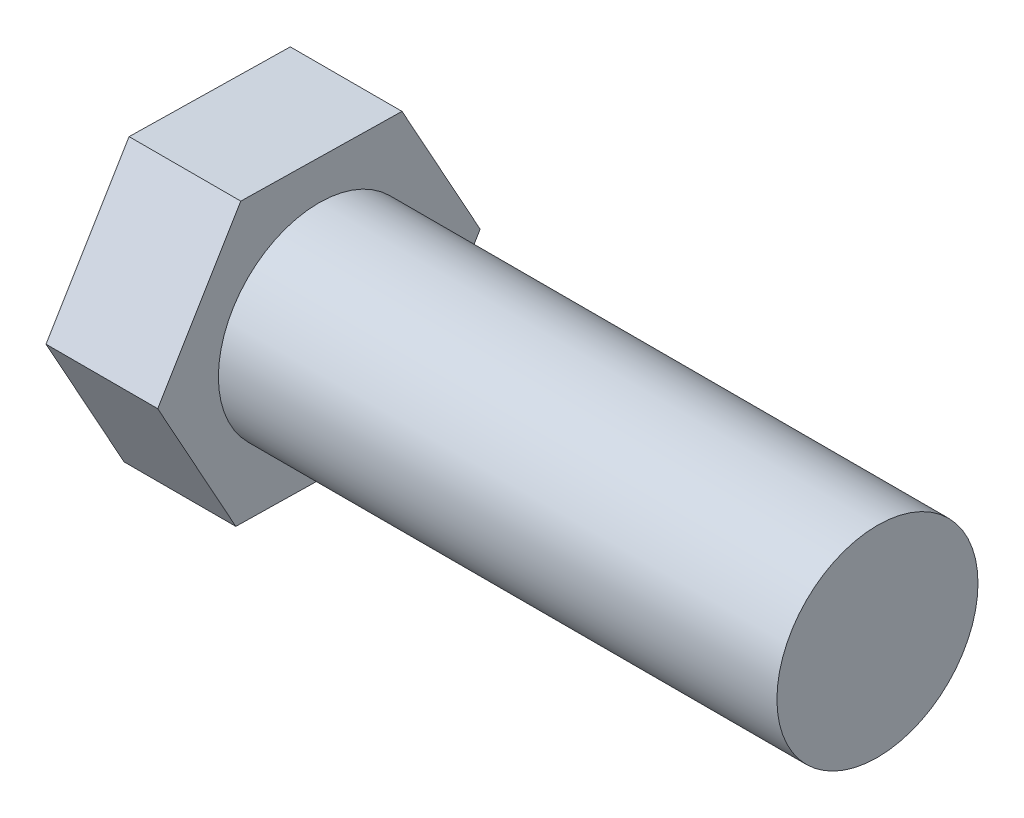
ISO-10303-21;
HEADER;
FILE_DESCRIPTION(('STEP AP214'),'2;1');
FILE_NAME('part.step','',(''),(''),'','','');
FILE_SCHEMA(('AUTOMOTIVE_DESIGN { 1 0 10303 214 1 1 1 1 }'));
ENDSEC;
DATA;
#1=APPLICATION_CONTEXT('core data for automotive mechanical design processes');
#2=APPLICATION_PROTOCOL_DEFINITION('international standard','automotive_design',2000,#1);
#3=PRODUCT_CONTEXT('',#1,'mechanical');
#4=PRODUCT('Part','Part','',(#3));
#5=PRODUCT_RELATED_PRODUCT_CATEGORY('part','',(#4));
#6=PRODUCT_DEFINITION_FORMATION('','',#4);
#7=PRODUCT_DEFINITION_CONTEXT('part definition',#1,'design');
#8=PRODUCT_DEFINITION('design','',#6,#7);
#9=PRODUCT_DEFINITION_SHAPE('','',#8);
#10=(LENGTH_UNIT() NAMED_UNIT(*) SI_UNIT(.MILLI.,.METRE.));
#11=(NAMED_UNIT(*) PLANE_ANGLE_UNIT() SI_UNIT($,.RADIAN.));
#12=(NAMED_UNIT(*) SI_UNIT($,.STERADIAN.) SOLID_ANGLE_UNIT());
#13=UNCERTAINTY_MEASURE_WITH_UNIT(LENGTH_MEASURE(1.E-05),#10,'distance_accuracy_value','');
#14=(GEOMETRIC_REPRESENTATION_CONTEXT(3) GLOBAL_UNCERTAINTY_ASSIGNED_CONTEXT((#13)) GLOBAL_UNIT_ASSIGNED_CONTEXT((#10,
#11,#12)) REPRESENTATION_CONTEXT('',''));
#15=CARTESIAN_POINT('',(0.,0.,0.));
#16=DIRECTION('',(0.,0.,1.));
#17=DIRECTION('',(1.,0.,0.));
#18=AXIS2_PLACEMENT_3D('',#15,#16,#17);
#19=CARTESIAN_POINT('',(-0.6,0.,0.));
#20=DIRECTION('',(-1.,0.,0.));
#21=DIRECTION('',(0.,0.,1.));
#22=AXIS2_PLACEMENT_3D('',#19,#20,#21);
#23=PLANE('',#22);
#24=DIRECTION('',(0.,0.856988725408425,-0.515335157468267));
#25=VECTOR('',#24,1.);
#26=CARTESIAN_POINT('',(-0.6,0.256906077015476,14.4314702161951));
#27=LINE('',#26,#25);
#28=CARTESIAN_POINT('',(-0.6,0.256906077015476,14.4314702161951));
#29=VERTEX_POINT('',#28);
#30=CARTESIAN_POINT('',(-0.6,12.6264728596912,6.99324791901554));
#31=VERTEX_POINT('',#30);
#32=EDGE_CURVE('E124',#29,#31,#27,.T.);
#33=ORIENTED_EDGE('',*,*,#32,.F.);
#34=DIRECTION('',(0.,0.874787700534985,0.484506428226409));
#35=VECTOR('',#34,1.);
#36=CARTESIAN_POINT('',(-0.6,-12.3695667826757,7.43822229717955));
#37=LINE('',#36,#35);
#38=CARTESIAN_POINT('',(-0.6,-12.3695667826757,7.43822229717955));
#39=VERTEX_POINT('',#38);
#40=EDGE_CURVE('E84',#39,#29,#37,.T.);
#41=ORIENTED_EDGE('',*,*,#40,.F.);
#42=DIRECTION('',(0.,0.0177989751265602,0.999841585694676));
#43=VECTOR('',#42,1.);
#44=CARTESIAN_POINT('',(-0.6,-12.6264728596912,-6.99324791901554));
#45=LINE('',#44,#43);
#46=CARTESIAN_POINT('',(-0.6,-12.6264728596912,-6.99324791901554));
#47=VERTEX_POINT('',#46);
#48=EDGE_CURVE('E78',#47,#39,#45,.T.);
#49=ORIENTED_EDGE('',*,*,#48,.F.);
#50=DIRECTION('',(0.,-0.856988725408425,0.515335157468266));
#51=VECTOR('',#50,1.);
#52=CARTESIAN_POINT('',(-0.6,-0.256906077015476,-14.4314702161951));
#53=LINE('',#52,#51);
#54=CARTESIAN_POINT('',(-0.6,-0.256906077015476,-14.4314702161951));
#55=VERTEX_POINT('',#54);
#56=EDGE_CURVE('E114',#55,#47,#53,.T.);
#57=ORIENTED_EDGE('',*,*,#56,.F.);
#58=DIRECTION('',(0.,-0.874787700534985,-0.484506428226409));
#59=VECTOR('',#58,1.);
#60=CARTESIAN_POINT('',(-0.6,12.3695667826757,-7.43822229717955));
#61=LINE('',#60,#59);
#62=CARTESIAN_POINT('',(-0.6,12.3695667826757,-7.43822229717955));
#63=VERTEX_POINT('',#62);
#64=EDGE_CURVE('E129',#63,#55,#61,.T.);
#65=ORIENTED_EDGE('',*,*,#64,.F.);
#66=DIRECTION('',(0.,-0.01779897512656,-0.999841585694676));
#67=VECTOR('',#66,1.);
#68=CARTESIAN_POINT('',(-0.6,12.6264728596912,6.99324791901554));
#69=LINE('',#68,#67);
#70=EDGE_CURVE('E127',#31,#63,#69,.T.);
#71=ORIENTED_EDGE('',*,*,#70,.F.);
#72=EDGE_LOOP('',(#33,#41,#49,#57,#65,#71));
#73=FACE_BOUND('',#72,.T.);
#74=CARTESIAN_POINT('',(-0.600000000000003,0.,0.));
#75=DIRECTION('',(-1.,0.,0.));
#76=DIRECTION('',(0.,0.,1.));
#77=AXIS2_PLACEMENT_3D('',#74,#75,#76);
#78=CIRCLE('',#77,9.);
#79=CARTESIAN_POINT('',(-0.600000000000003,0.,9.));
#80=VERTEX_POINT('',#79);
#81=EDGE_CURVE('E47',#80,#80,#78,.T.);
#82=ORIENTED_EDGE('',*,*,#81,.T.);
#83=EDGE_LOOP('',(#82));
#84=FACE_BOUND('',#83,.T.);
#85=ADVANCED_FACE('F38',(#73,#84),#23,.F.);
#86=CARTESIAN_POINT('',(-10.6,0.256906077015476,14.4314702161951));
#87=DIRECTION('',(0.,-0.515335157468267,-0.856988725408425));
#88=DIRECTION('',(0.,0.856988725408425,-0.515335157468267));
#89=AXIS2_PLACEMENT_3D('',#86,#87,#88);
#90=PLANE('',#89);
#91=ORIENTED_EDGE('',*,*,#32,.T.);
#92=DIRECTION('',(1.,0.,0.));
#93=VECTOR('',#92,1.);
#94=CARTESIAN_POINT('',(-10.6,12.6264728596912,6.99324791901554));
#95=LINE('',#94,#93);
#96=CARTESIAN_POINT('',(-10.6,12.6264728596912,6.99324791901554));
#97=VERTEX_POINT('',#96);
#98=EDGE_CURVE('E141',#97,#31,#95,.T.);
#99=ORIENTED_EDGE('',*,*,#98,.F.);
#100=DIRECTION('',(0.,0.856988725408425,-0.515335157468267));
#101=VECTOR('',#100,1.);
#102=CARTESIAN_POINT('',(-10.6,0.256906077015476,14.4314702161951));
#103=LINE('',#102,#101);
#104=CARTESIAN_POINT('',(-10.6,0.256906077015476,14.4314702161951));
#105=VERTEX_POINT('',#104);
#106=EDGE_CURVE('E134',#105,#97,#103,.T.);
#107=ORIENTED_EDGE('',*,*,#106,.F.);
#108=DIRECTION('',(1.,0.,0.));
#109=VECTOR('',#108,1.);
#110=CARTESIAN_POINT('',(-10.6,0.256906077015476,14.4314702161951));
#111=LINE('',#110,#109);
#112=EDGE_CURVE('E120',#105,#29,#111,.T.);
#113=ORIENTED_EDGE('',*,*,#112,.T.);
#114=EDGE_LOOP('',(#91,#99,#107,#113));
#115=FACE_BOUND('',#114,.T.);
#116=ADVANCED_FACE('F158',(#115),#90,.F.);
#117=CARTESIAN_POINT('',(-10.6,12.6264728596912,6.99324791901554));
#118=DIRECTION('',(0.,-0.999841585694676,0.01779897512656));
#119=DIRECTION('',(0.,-0.01779897512656,-0.999841585694676));
#120=AXIS2_PLACEMENT_3D('',#117,#118,#119);
#121=PLANE('',#120);
#122=ORIENTED_EDGE('',*,*,#70,.T.);
#123=DIRECTION('',(1.,0.,0.));
#124=VECTOR('',#123,1.);
#125=CARTESIAN_POINT('',(-10.6,12.3695667826757,-7.43822229717955));
#126=LINE('',#125,#124);
#127=CARTESIAN_POINT('',(-10.6,12.3695667826757,-7.43822229717955));
#128=VERTEX_POINT('',#127);
#129=EDGE_CURVE('E138',#128,#63,#126,.T.);
#130=ORIENTED_EDGE('',*,*,#129,.F.);
#131=DIRECTION('',(0.,-0.01779897512656,-0.999841585694676));
#132=VECTOR('',#131,1.);
#133=CARTESIAN_POINT('',(-10.6,12.6264728596912,6.99324791901554));
#134=LINE('',#133,#132);
#135=EDGE_CURVE('E93',#97,#128,#134,.T.);
#136=ORIENTED_EDGE('',*,*,#135,.F.);
#137=ORIENTED_EDGE('',*,*,#98,.T.);
#138=EDGE_LOOP('',(#122,#130,#136,#137));
#139=FACE_BOUND('',#138,.T.);
#140=ADVANCED_FACE('F164',(#139),#121,.F.);
#141=CARTESIAN_POINT('',(-10.6,12.3695667826757,-7.43822229717955));
#142=DIRECTION('',(0.,-0.484506428226409,0.874787700534986));
#143=DIRECTION('',(0.,-0.874787700534986,-0.484506428226409));
#144=AXIS2_PLACEMENT_3D('',#141,#142,#143);
#145=PLANE('',#144);
#146=ORIENTED_EDGE('',*,*,#64,.T.);
#147=DIRECTION('',(1.,0.,0.));
#148=VECTOR('',#147,1.);
#149=CARTESIAN_POINT('',(-10.6,-0.256906077015476,-14.4314702161951));
#150=LINE('',#149,#148);
#151=CARTESIAN_POINT('',(-10.6,-0.256906077015476,-14.4314702161951));
#152=VERTEX_POINT('',#151);
#153=EDGE_CURVE('E115',#152,#55,#150,.T.);
#154=ORIENTED_EDGE('',*,*,#153,.F.);
#155=DIRECTION('',(0.,-0.874787700534985,-0.484506428226409));
#156=VECTOR('',#155,1.);
#157=CARTESIAN_POINT('',(-10.6,12.3695667826757,-7.43822229717955));
#158=LINE('',#157,#156);
#159=EDGE_CURVE('E106',#128,#152,#158,.T.);
#160=ORIENTED_EDGE('',*,*,#159,.F.);
#161=ORIENTED_EDGE('',*,*,#129,.T.);
#162=EDGE_LOOP('',(#146,#154,#160,#161));
#163=FACE_BOUND('',#162,.T.);
#164=ADVANCED_FACE('F175',(#163),#145,.F.);
#165=CARTESIAN_POINT('',(-10.6,-0.256906077015476,-14.4314702161951));
#166=DIRECTION('',(0.,0.515335157468266,0.856988725408425));
#167=DIRECTION('',(0.,-0.856988725408425,0.515335157468266));
#168=AXIS2_PLACEMENT_3D('',#165,#166,#167);
#169=PLANE('',#168);
#170=ORIENTED_EDGE('',*,*,#56,.T.);
#171=DIRECTION('',(1.,0.,0.));
#172=VECTOR('',#171,1.);
#173=CARTESIAN_POINT('',(-10.6,-12.6264728596912,-6.99324791901554));
#174=LINE('',#173,#172);
#175=CARTESIAN_POINT('',(-10.6,-12.6264728596912,-6.99324791901554));
#176=VERTEX_POINT('',#175);
#177=EDGE_CURVE('E111',#176,#47,#174,.T.);
#178=ORIENTED_EDGE('',*,*,#177,.F.);
#179=DIRECTION('',(0.,-0.856988725408425,0.515335157468266));
#180=VECTOR('',#179,1.);
#181=CARTESIAN_POINT('',(-10.6,-0.256906077015476,-14.4314702161951));
#182=LINE('',#181,#180);
#183=EDGE_CURVE('E100',#152,#176,#182,.T.);
#184=ORIENTED_EDGE('',*,*,#183,.F.);
#185=ORIENTED_EDGE('',*,*,#153,.T.);
#186=EDGE_LOOP('',(#170,#178,#184,#185));
#187=FACE_BOUND('',#186,.T.);
#188=ADVANCED_FACE('F112',(#187),#169,.F.);
#189=CARTESIAN_POINT('',(-10.6,-12.6264728596912,-6.99324791901554));
#190=DIRECTION('',(0.,0.999841585694676,-0.0177989751265602));
#191=DIRECTION('',(0.,0.0177989751265602,0.999841585694676));
#192=AXIS2_PLACEMENT_3D('',#189,#190,#191);
#193=PLANE('',#192);
#194=ORIENTED_EDGE('',*,*,#48,.T.);
#195=DIRECTION('',(1.,0.,0.));
#196=VECTOR('',#195,1.);
#197=CARTESIAN_POINT('',(-10.6,-12.3695667826757,7.43822229717955));
#198=LINE('',#197,#196);
#199=CARTESIAN_POINT('',(-10.6,-12.3695667826757,7.43822229717955));
#200=VERTEX_POINT('',#199);
#201=EDGE_CURVE('E116',#200,#39,#198,.T.);
#202=ORIENTED_EDGE('',*,*,#201,.F.);
#203=DIRECTION('',(0.,0.0177989751265602,0.999841585694676));
#204=VECTOR('',#203,1.);
#205=CARTESIAN_POINT('',(-10.6,-12.6264728596912,-6.99324791901554));
#206=LINE('',#205,#204);
#207=EDGE_CURVE('E104',#176,#200,#206,.T.);
#208=ORIENTED_EDGE('',*,*,#207,.F.);
#209=ORIENTED_EDGE('',*,*,#177,.T.);
#210=EDGE_LOOP('',(#194,#202,#208,#209));
#211=FACE_BOUND('',#210,.T.);
#212=ADVANCED_FACE('F118',(#211),#193,.F.);
#213=CARTESIAN_POINT('',(-10.6,-12.3695667826757,7.43822229717955));
#214=DIRECTION('',(0.,0.48450642822641,-0.874787700534985));
#215=DIRECTION('',(0.,0.874787700534985,0.48450642822641));
#216=AXIS2_PLACEMENT_3D('',#213,#214,#215);
#217=PLANE('',#216);
#218=ORIENTED_EDGE('',*,*,#40,.T.);
#219=ORIENTED_EDGE('',*,*,#112,.F.);
#220=DIRECTION('',(0.,0.874787700534985,0.484506428226409));
#221=VECTOR('',#220,1.);
#222=CARTESIAN_POINT('',(-10.6,-12.3695667826757,7.43822229717955));
#223=LINE('',#222,#221);
#224=EDGE_CURVE('E55',#200,#105,#223,.T.);
#225=ORIENTED_EDGE('',*,*,#224,.F.);
#226=ORIENTED_EDGE('',*,*,#201,.T.);
#227=EDGE_LOOP('',(#218,#219,#225,#226));
#228=FACE_BOUND('',#227,.T.);
#229=ADVANCED_FACE('F154',(#228),#217,.F.);
#230=CARTESIAN_POINT('',(-10.6,0.,0.));
#231=DIRECTION('',(-1.,0.,0.));
#232=DIRECTION('',(0.,0.,1.));
#233=AXIS2_PLACEMENT_3D('',#230,#231,#232);
#234=PLANE('',#233);
#235=ORIENTED_EDGE('',*,*,#106,.T.);
#236=ORIENTED_EDGE('',*,*,#135,.T.);
#237=ORIENTED_EDGE('',*,*,#159,.T.);
#238=ORIENTED_EDGE('',*,*,#183,.T.);
#239=ORIENTED_EDGE('',*,*,#207,.T.);
#240=ORIENTED_EDGE('',*,*,#224,.T.);
#241=EDGE_LOOP('',(#235,#236,#237,#238,#239,#240));
#242=FACE_BOUND('',#241,.T.);
#243=ADVANCED_FACE('F102',(#242),#234,.T.);
#244=CARTESIAN_POINT('',(49.4,0.,0.));
#245=DIRECTION('',(-1.,0.,0.));
#246=DIRECTION('',(0.,0.,1.));
#247=AXIS2_PLACEMENT_3D('',#244,#245,#246);
#248=CYLINDRICAL_SURFACE('',#247,9.);
#249=CARTESIAN_POINT('',(49.4,0.,0.));
#250=DIRECTION('',(1.,0.,0.));
#251=DIRECTION('',(0.,0.,-1.));
#252=AXIS2_PLACEMENT_3D('',#249,#250,#251);
#253=CIRCLE('',#252,9.);
#254=CARTESIAN_POINT('',(49.4,0.,-9.));
#255=VERTEX_POINT('',#254);
#256=EDGE_CURVE('E11',#255,#255,#253,.T.);
#257=ORIENTED_EDGE('',*,*,#256,.F.);
#258=EDGE_LOOP('',(#257));
#259=FACE_BOUND('',#258,.T.);
#260=ORIENTED_EDGE('',*,*,#81,.F.);
#261=EDGE_LOOP('',(#260));
#262=FACE_BOUND('',#261,.T.);
#263=ADVANCED_FACE('F40',(#259,#262),#248,.T.);
#264=CARTESIAN_POINT('',(49.4,0.,0.));
#265=DIRECTION('',(1.,0.,0.));
#266=DIRECTION('',(0.,0.,-1.));
#267=AXIS2_PLACEMENT_3D('',#264,#265,#266);
#268=PLANE('',#267);
#269=ORIENTED_EDGE('',*,*,#256,.T.);
#270=EDGE_LOOP('',(#269));
#271=FACE_BOUND('',#270,.T.);
#272=ADVANCED_FACE('F147',(#271),#268,.T.);
#273=CLOSED_SHELL('',(#85,#116,#140,#164,#188,#212,#229,#243,#263,#272));
#274=MANIFOLD_SOLID_BREP('B2',#273);
#275=ADVANCED_BREP_SHAPE_REPRESENTATION('',(#18,#274),#14);
#276=SHAPE_DEFINITION_REPRESENTATION(#9,#275);
ENDSEC;
END-ISO-10303-21;
